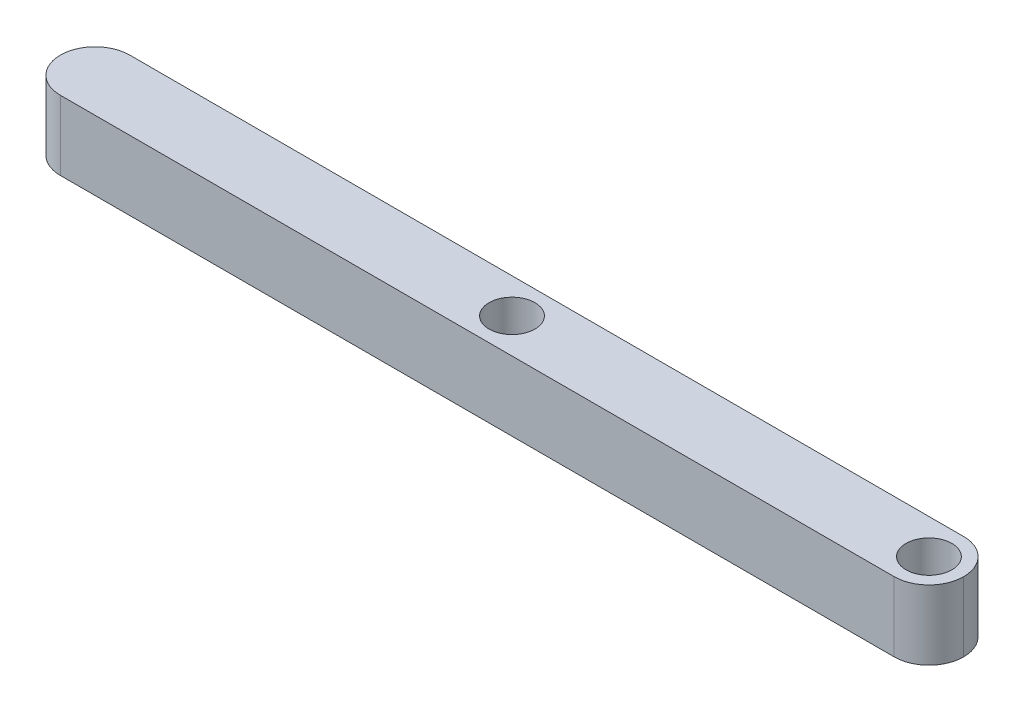
ISO-10303-21;
HEADER;
FILE_DESCRIPTION(('STEP AP214'),'2;1');
FILE_NAME('part.step','',(''),(''),'','','');
FILE_SCHEMA(('AUTOMOTIVE_DESIGN { 1 0 10303 214 1 1 1 1 }'));
ENDSEC;
DATA;
#1=APPLICATION_CONTEXT('core data for automotive mechanical design processes');
#2=APPLICATION_PROTOCOL_DEFINITION('international standard','automotive_design',2000,#1);
#3=PRODUCT_CONTEXT('',#1,'mechanical');
#4=PRODUCT('Part','Part','',(#3));
#5=PRODUCT_RELATED_PRODUCT_CATEGORY('part','',(#4));
#6=PRODUCT_DEFINITION_FORMATION('','',#4);
#7=PRODUCT_DEFINITION_CONTEXT('part definition',#1,'design');
#8=PRODUCT_DEFINITION('design','',#6,#7);
#9=PRODUCT_DEFINITION_SHAPE('','',#8);
#10=(LENGTH_UNIT() NAMED_UNIT(*) SI_UNIT(.MILLI.,.METRE.));
#11=(NAMED_UNIT(*) PLANE_ANGLE_UNIT() SI_UNIT($,.RADIAN.));
#12=(NAMED_UNIT(*) SI_UNIT($,.STERADIAN.) SOLID_ANGLE_UNIT());
#13=UNCERTAINTY_MEASURE_WITH_UNIT(LENGTH_MEASURE(1.E-05),#10,'distance_accuracy_value','');
#14=(GEOMETRIC_REPRESENTATION_CONTEXT(3) GLOBAL_UNCERTAINTY_ASSIGNED_CONTEXT((#13)) GLOBAL_UNIT_ASSIGNED_CONTEXT((#10,
#11,#12)) REPRESENTATION_CONTEXT('',''));
#15=CARTESIAN_POINT('',(0.,0.,0.));
#16=DIRECTION('',(0.,0.,1.));
#17=DIRECTION('',(1.,0.,0.));
#18=AXIS2_PLACEMENT_3D('',#15,#16,#17);
#19=CARTESIAN_POINT('',(0.,50.,0.));
#20=DIRECTION('',(0.,-1.,0.));
#21=DIRECTION('',(0.,0.,-1.));
#22=AXIS2_PLACEMENT_3D('',#19,#20,#21);
#23=PLANE('',#22);
#24=DIRECTION('',(-1.,0.,0.));
#25=VECTOR('',#24,1.);
#26=CARTESIAN_POINT('',(0.,50.,-50.));
#27=LINE('',#26,#25);
#28=CARTESIAN_POINT('',(625.,50.,-50.));
#29=VERTEX_POINT('',#28);
#30=CARTESIAN_POINT('',(25.,50.,-50.));
#31=VERTEX_POINT('',#30);
#32=EDGE_CURVE('E145',#29,#31,#27,.T.);
#33=ORIENTED_EDGE('',*,*,#32,.T.);
#34=CARTESIAN_POINT('',(25.,50.,-25.));
#35=DIRECTION('',(0.,-1.,0.));
#36=DIRECTION('',(0.,0.,-1.));
#37=AXIS2_PLACEMENT_3D('',#34,#35,#36);
#38=CIRCLE('',#37,25.);
#39=CARTESIAN_POINT('',(0.,50.,-25.));
#40=VERTEX_POINT('',#39);
#41=EDGE_CURVE('E138',#31,#40,#38,.F.);
#42=ORIENTED_EDGE('',*,*,#41,.T.);
#43=CARTESIAN_POINT('',(25.,50.,-25.));
#44=DIRECTION('',(0.,-1.,0.));
#45=DIRECTION('',(0.,0.,-1.));
#46=AXIS2_PLACEMENT_3D('',#43,#44,#45);
#47=CIRCLE('',#46,25.);
#48=CARTESIAN_POINT('',(25.,50.,0.));
#49=VERTEX_POINT('',#48);
#50=EDGE_CURVE('E113',#40,#49,#47,.F.);
#51=ORIENTED_EDGE('',*,*,#50,.T.);
#52=DIRECTION('',(1.,0.,0.));
#53=VECTOR('',#52,1.);
#54=CARTESIAN_POINT('',(0.,50.,0.));
#55=LINE('',#54,#53);
#56=CARTESIAN_POINT('',(625.,50.,0.));
#57=VERTEX_POINT('',#56);
#58=EDGE_CURVE('E151',#49,#57,#55,.T.);
#59=ORIENTED_EDGE('',*,*,#58,.T.);
#60=CARTESIAN_POINT('',(625.,50.,-25.));
#61=DIRECTION('',(0.,-1.,0.));
#62=DIRECTION('',(0.,0.,-1.));
#63=AXIS2_PLACEMENT_3D('',#60,#61,#62);
#64=CIRCLE('',#63,25.);
#65=CARTESIAN_POINT('',(650.,50.,-25.));
#66=VERTEX_POINT('',#65);
#67=EDGE_CURVE('E57',#57,#66,#64,.F.);
#68=ORIENTED_EDGE('',*,*,#67,.T.);
#69=CARTESIAN_POINT('',(625.,50.,-25.));
#70=DIRECTION('',(0.,-1.,0.));
#71=DIRECTION('',(0.,0.,-1.));
#72=AXIS2_PLACEMENT_3D('',#69,#70,#71);
#73=CIRCLE('',#72,25.);
#74=EDGE_CURVE('E133',#66,#29,#73,.F.);
#75=ORIENTED_EDGE('',*,*,#74,.T.);
#76=EDGE_LOOP('',(#33,#42,#51,#59,#68,#75));
#77=FACE_BOUND('',#76,.T.);
#78=CARTESIAN_POINT('',(325.,50.,-25.));
#79=DIRECTION('',(0.,1.,0.));
#80=DIRECTION('',(0.,0.,1.));
#81=AXIS2_PLACEMENT_3D('',#78,#79,#80);
#82=CIRCLE('',#81,16.5);
#83=CARTESIAN_POINT('',(325.,50.,-8.5));
#84=VERTEX_POINT('',#83);
#85=EDGE_CURVE('E156',#84,#84,#82,.T.);
#86=ORIENTED_EDGE('',*,*,#85,.F.);
#87=EDGE_LOOP('',(#86));
#88=FACE_BOUND('',#87,.T.);
#89=CARTESIAN_POINT('',(625.,50.,-25.));
#90=DIRECTION('',(0.,1.,0.));
#91=DIRECTION('',(0.,0.,1.));
#92=AXIS2_PLACEMENT_3D('',#89,#90,#91);
#93=CIRCLE('',#92,16.5);
#94=CARTESIAN_POINT('',(625.,50.,-8.50000000000001));
#95=VERTEX_POINT('',#94);
#96=EDGE_CURVE('E173',#95,#95,#93,.T.);
#97=ORIENTED_EDGE('',*,*,#96,.F.);
#98=EDGE_LOOP('',(#97));
#99=FACE_BOUND('',#98,.T.);
#100=ADVANCED_FACE('F39',(#77,#88,#99),#23,.F.);
#101=CARTESIAN_POINT('',(0.,0.,0.));
#102=DIRECTION('',(0.,-1.,0.));
#103=DIRECTION('',(0.,0.,-1.));
#104=AXIS2_PLACEMENT_3D('',#101,#102,#103);
#105=PLANE('',#104);
#106=CARTESIAN_POINT('',(325.,0.,-25.));
#107=DIRECTION('',(0.,1.,0.));
#108=DIRECTION('',(0.,0.,1.));
#109=AXIS2_PLACEMENT_3D('',#106,#107,#108);
#110=CIRCLE('',#109,16.5);
#111=CARTESIAN_POINT('',(325.,0.,-8.5));
#112=VERTEX_POINT('',#111);
#113=EDGE_CURVE('E177',#112,#112,#110,.T.);
#114=ORIENTED_EDGE('',*,*,#113,.T.);
#115=EDGE_LOOP('',(#114));
#116=FACE_BOUND('',#115,.T.);
#117=CARTESIAN_POINT('',(25.,0.,-25.));
#118=DIRECTION('',(0.,-1.,0.));
#119=DIRECTION('',(0.,0.,-1.));
#120=AXIS2_PLACEMENT_3D('',#117,#118,#119);
#121=CIRCLE('',#120,25.);
#122=CARTESIAN_POINT('',(25.,0.,0.));
#123=VERTEX_POINT('',#122);
#124=CARTESIAN_POINT('',(0.,0.,-25.));
#125=VERTEX_POINT('',#124);
#126=EDGE_CURVE('E95',#123,#125,#121,.T.);
#127=ORIENTED_EDGE('',*,*,#126,.T.);
#128=CARTESIAN_POINT('',(25.,0.,-25.));
#129=DIRECTION('',(0.,-1.,0.));
#130=DIRECTION('',(0.,0.,-1.));
#131=AXIS2_PLACEMENT_3D('',#128,#129,#130);
#132=CIRCLE('',#131,25.);
#133=CARTESIAN_POINT('',(25.,0.,-50.));
#134=VERTEX_POINT('',#133);
#135=EDGE_CURVE('E101',#125,#134,#132,.T.);
#136=ORIENTED_EDGE('',*,*,#135,.T.);
#137=DIRECTION('',(-1.,0.,0.));
#138=VECTOR('',#137,1.);
#139=CARTESIAN_POINT('',(0.,0.,-50.));
#140=LINE('',#139,#138);
#141=CARTESIAN_POINT('',(625.,0.,-50.));
#142=VERTEX_POINT('',#141);
#143=EDGE_CURVE('E149',#142,#134,#140,.T.);
#144=ORIENTED_EDGE('',*,*,#143,.F.);
#145=CARTESIAN_POINT('',(625.,0.,-25.));
#146=DIRECTION('',(0.,-1.,0.));
#147=DIRECTION('',(0.,0.,-1.));
#148=AXIS2_PLACEMENT_3D('',#145,#146,#147);
#149=CIRCLE('',#148,25.);
#150=CARTESIAN_POINT('',(650.,0.,-25.));
#151=VERTEX_POINT('',#150);
#152=EDGE_CURVE('E107',#142,#151,#149,.T.);
#153=ORIENTED_EDGE('',*,*,#152,.T.);
#154=CARTESIAN_POINT('',(625.,0.,-25.));
#155=DIRECTION('',(0.,-1.,0.));
#156=DIRECTION('',(0.,0.,-1.));
#157=AXIS2_PLACEMENT_3D('',#154,#155,#156);
#158=CIRCLE('',#157,25.);
#159=CARTESIAN_POINT('',(625.,0.,0.));
#160=VERTEX_POINT('',#159);
#161=EDGE_CURVE('E160',#151,#160,#158,.T.);
#162=ORIENTED_EDGE('',*,*,#161,.T.);
#163=DIRECTION('',(1.,0.,0.));
#164=VECTOR('',#163,1.);
#165=CARTESIAN_POINT('',(0.,0.,0.));
#166=LINE('',#165,#164);
#167=EDGE_CURVE('E103',#123,#160,#166,.T.);
#168=ORIENTED_EDGE('',*,*,#167,.F.);
#169=EDGE_LOOP('',(#127,#136,#144,#153,#162,#168));
#170=FACE_BOUND('',#169,.T.);
#171=CARTESIAN_POINT('',(625.,0.,-25.));
#172=DIRECTION('',(0.,1.,0.));
#173=DIRECTION('',(0.,0.,1.));
#174=AXIS2_PLACEMENT_3D('',#171,#172,#173);
#175=CIRCLE('',#174,16.5);
#176=CARTESIAN_POINT('',(625.,0.,-8.50000000000001));
#177=VERTEX_POINT('',#176);
#178=EDGE_CURVE('E116',#177,#177,#175,.T.);
#179=ORIENTED_EDGE('',*,*,#178,.T.);
#180=EDGE_LOOP('',(#179));
#181=FACE_BOUND('',#180,.T.);
#182=ADVANCED_FACE('F97',(#116,#170,#181),#105,.T.);
#183=CARTESIAN_POINT('',(0.,50.,0.));
#184=DIRECTION('',(0.,0.,-1.));
#185=DIRECTION('',(-1.,0.,0.));
#186=AXIS2_PLACEMENT_3D('',#183,#184,#185);
#187=PLANE('',#186);
#188=ORIENTED_EDGE('',*,*,#58,.F.);
#189=DIRECTION('',(0.,-1.,0.));
#190=VECTOR('',#189,1.);
#191=CARTESIAN_POINT('',(25.,50.,0.));
#192=LINE('',#191,#190);
#193=EDGE_CURVE('E11',#49,#123,#192,.T.);
#194=ORIENTED_EDGE('',*,*,#193,.T.);
#195=ORIENTED_EDGE('',*,*,#167,.T.);
#196=DIRECTION('',(0.,-1.,0.));
#197=VECTOR('',#196,1.);
#198=CARTESIAN_POINT('',(625.,50.,0.));
#199=LINE('',#198,#197);
#200=EDGE_CURVE('E49',#160,#57,#199,.F.);
#201=ORIENTED_EDGE('',*,*,#200,.T.);
#202=EDGE_LOOP('',(#188,#194,#195,#201));
#203=FACE_BOUND('',#202,.T.);
#204=ADVANCED_FACE('F200',(#203),#187,.F.);
#205=CARTESIAN_POINT('',(0.,50.,-50.));
#206=DIRECTION('',(0.,0.,1.));
#207=DIRECTION('',(1.,0.,0.));
#208=AXIS2_PLACEMENT_3D('',#205,#206,#207);
#209=PLANE('',#208);
#210=ORIENTED_EDGE('',*,*,#143,.T.);
#211=DIRECTION('',(0.,-1.,0.));
#212=VECTOR('',#211,1.);
#213=CARTESIAN_POINT('',(25.,50.,-50.));
#214=LINE('',#213,#212);
#215=EDGE_CURVE('E120',#134,#31,#214,.F.);
#216=ORIENTED_EDGE('',*,*,#215,.T.);
#217=ORIENTED_EDGE('',*,*,#32,.F.);
#218=DIRECTION('',(0.,-1.,0.));
#219=VECTOR('',#218,1.);
#220=CARTESIAN_POINT('',(625.,50.,-50.));
#221=LINE('',#220,#219);
#222=EDGE_CURVE('E122',#29,#142,#221,.T.);
#223=ORIENTED_EDGE('',*,*,#222,.T.);
#224=EDGE_LOOP('',(#210,#216,#217,#223));
#225=FACE_BOUND('',#224,.T.);
#226=ADVANCED_FACE('F147',(#225),#209,.F.);
#227=CARTESIAN_POINT('',(325.,50.,-25.));
#228=DIRECTION('',(0.,-1.,0.));
#229=DIRECTION('',(0.,0.,-1.));
#230=AXIS2_PLACEMENT_3D('',#227,#228,#229);
#231=CYLINDRICAL_SURFACE('',#230,16.5);
#232=ORIENTED_EDGE('',*,*,#85,.T.);
#233=EDGE_LOOP('',(#232));
#234=FACE_BOUND('',#233,.T.);
#235=ORIENTED_EDGE('',*,*,#113,.F.);
#236=EDGE_LOOP('',(#235));
#237=FACE_BOUND('',#236,.T.);
#238=ADVANCED_FACE('F187',(#234,#237),#231,.F.);
#239=CARTESIAN_POINT('',(625.,50.,-25.));
#240=DIRECTION('',(0.,-1.,0.));
#241=DIRECTION('',(0.,0.,-1.));
#242=AXIS2_PLACEMENT_3D('',#239,#240,#241);
#243=CYLINDRICAL_SURFACE('',#242,16.5);
#244=ORIENTED_EDGE('',*,*,#96,.T.);
#245=EDGE_LOOP('',(#244));
#246=FACE_BOUND('',#245,.T.);
#247=ORIENTED_EDGE('',*,*,#178,.F.);
#248=EDGE_LOOP('',(#247));
#249=FACE_BOUND('',#248,.T.);
#250=ADVANCED_FACE('F194',(#246,#249),#243,.F.);
#251=CARTESIAN_POINT('',(25.,50.,-25.));
#252=DIRECTION('',(0.,-1.,0.));
#253=DIRECTION('',(0.,0.,-1.));
#254=AXIS2_PLACEMENT_3D('',#251,#252,#253);
#255=CYLINDRICAL_SURFACE('',#254,25.);
#256=ORIENTED_EDGE('',*,*,#193,.F.);
#257=ORIENTED_EDGE('',*,*,#50,.F.);
#258=DIRECTION('',(0.,-1.,0.));
#259=VECTOR('',#258,1.);
#260=CARTESIAN_POINT('',(0.,50.,-25.));
#261=LINE('',#260,#259);
#262=EDGE_CURVE('E111',#125,#40,#261,.F.);
#263=ORIENTED_EDGE('',*,*,#262,.F.);
#264=ORIENTED_EDGE('',*,*,#126,.F.);
#265=EDGE_LOOP('',(#256,#257,#263,#264));
#266=FACE_BOUND('',#265,.T.);
#267=ADVANCED_FACE('F112',(#266),#255,.T.);
#268=CARTESIAN_POINT('',(25.,50.,-25.));
#269=DIRECTION('',(0.,-1.,0.));
#270=DIRECTION('',(0.,0.,-1.));
#271=AXIS2_PLACEMENT_3D('',#268,#269,#270);
#272=CYLINDRICAL_SURFACE('',#271,25.);
#273=ORIENTED_EDGE('',*,*,#41,.F.);
#274=ORIENTED_EDGE('',*,*,#215,.F.);
#275=ORIENTED_EDGE('',*,*,#135,.F.);
#276=ORIENTED_EDGE('',*,*,#262,.T.);
#277=EDGE_LOOP('',(#273,#274,#275,#276));
#278=FACE_BOUND('',#277,.T.);
#279=ADVANCED_FACE('F118',(#278),#272,.T.);
#280=CARTESIAN_POINT('',(625.,50.,-25.));
#281=DIRECTION('',(0.,-1.,0.));
#282=DIRECTION('',(0.,0.,-1.));
#283=AXIS2_PLACEMENT_3D('',#280,#281,#282);
#284=CYLINDRICAL_SURFACE('',#283,25.);
#285=DIRECTION('',(0.,-1.,0.));
#286=VECTOR('',#285,1.);
#287=CARTESIAN_POINT('',(650.,50.,-25.));
#288=LINE('',#287,#286);
#289=EDGE_CURVE('E43',#66,#151,#288,.T.);
#290=ORIENTED_EDGE('',*,*,#289,.F.);
#291=ORIENTED_EDGE('',*,*,#67,.F.);
#292=ORIENTED_EDGE('',*,*,#200,.F.);
#293=ORIENTED_EDGE('',*,*,#161,.F.);
#294=EDGE_LOOP('',(#290,#291,#292,#293));
#295=FACE_BOUND('',#294,.T.);
#296=ADVANCED_FACE('F41',(#295),#284,.T.);
#297=CARTESIAN_POINT('',(625.,50.,-25.));
#298=DIRECTION('',(0.,-1.,0.));
#299=DIRECTION('',(0.,0.,-1.));
#300=AXIS2_PLACEMENT_3D('',#297,#298,#299);
#301=CYLINDRICAL_SURFACE('',#300,25.);
#302=ORIENTED_EDGE('',*,*,#74,.F.);
#303=ORIENTED_EDGE('',*,*,#289,.T.);
#304=ORIENTED_EDGE('',*,*,#152,.F.);
#305=ORIENTED_EDGE('',*,*,#222,.F.);
#306=EDGE_LOOP('',(#302,#303,#304,#305));
#307=FACE_BOUND('',#306,.T.);
#308=ADVANCED_FACE('F168',(#307),#301,.T.);
#309=CLOSED_SHELL('',(#100,#182,#204,#226,#238,#250,#267,#279,#296,#308));
#310=MANIFOLD_SOLID_BREP('B2',#309);
#311=ADVANCED_BREP_SHAPE_REPRESENTATION('',(#18,#310),#14);
#312=SHAPE_DEFINITION_REPRESENTATION(#9,#311);
ENDSEC;
END-ISO-10303-21;
